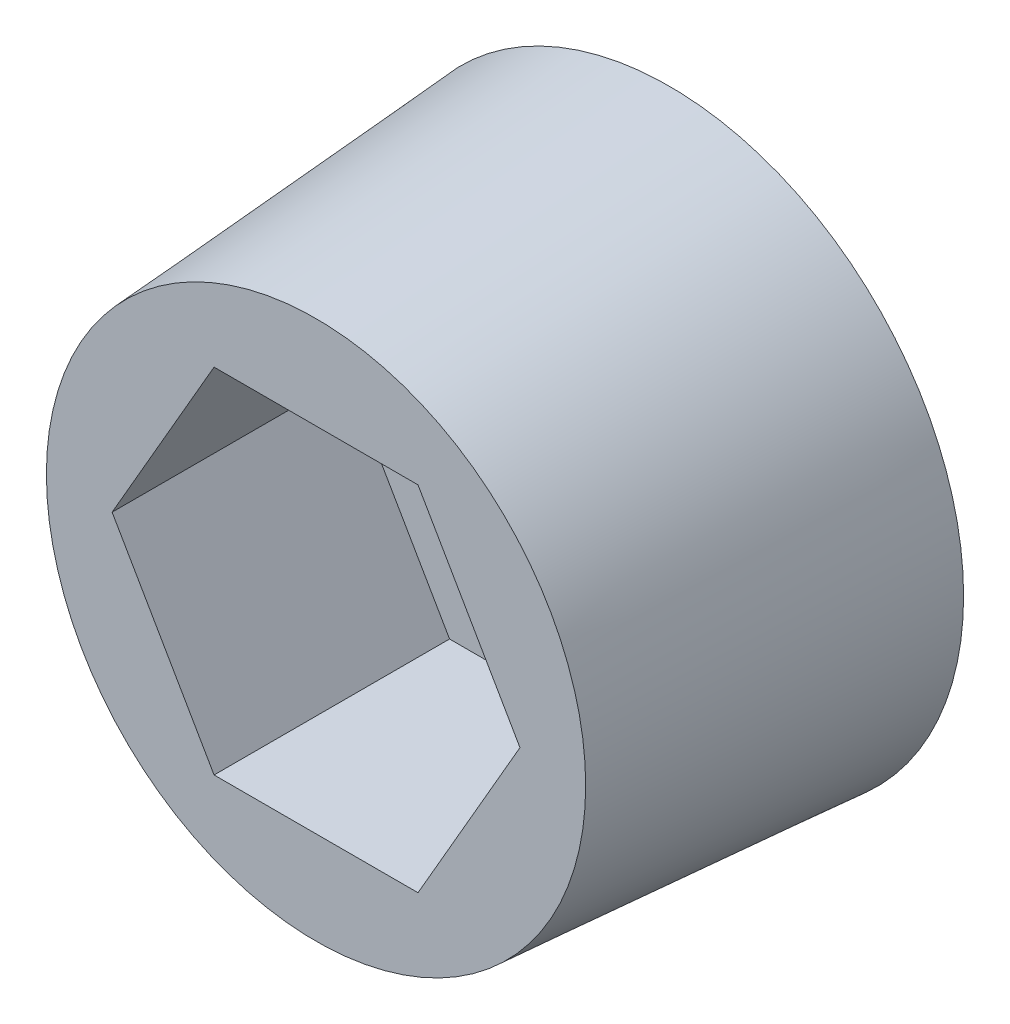
ISO-10303-21;
HEADER;
FILE_DESCRIPTION(('STEP AP214'),'2;1');
FILE_NAME('part.step','',(''),(''),'','','');
FILE_SCHEMA(('AUTOMOTIVE_DESIGN { 1 0 10303 214 1 1 1 1 }'));
ENDSEC;
DATA;
#1=APPLICATION_CONTEXT('core data for automotive mechanical design processes');
#2=APPLICATION_PROTOCOL_DEFINITION('international standard','automotive_design',2000,#1);
#3=PRODUCT_CONTEXT('',#1,'mechanical');
#4=PRODUCT('Part','Part','',(#3));
#5=PRODUCT_RELATED_PRODUCT_CATEGORY('part','',(#4));
#6=PRODUCT_DEFINITION_FORMATION('','',#4);
#7=PRODUCT_DEFINITION_CONTEXT('part definition',#1,'design');
#8=PRODUCT_DEFINITION('design','',#6,#7);
#9=PRODUCT_DEFINITION_SHAPE('','',#8);
#10=(LENGTH_UNIT() NAMED_UNIT(*) SI_UNIT(.MILLI.,.METRE.));
#11=(NAMED_UNIT(*) PLANE_ANGLE_UNIT() SI_UNIT($,.RADIAN.));
#12=(NAMED_UNIT(*) SI_UNIT($,.STERADIAN.) SOLID_ANGLE_UNIT());
#13=UNCERTAINTY_MEASURE_WITH_UNIT(LENGTH_MEASURE(1.E-05),#10,'distance_accuracy_value','');
#14=(GEOMETRIC_REPRESENTATION_CONTEXT(3) GLOBAL_UNCERTAINTY_ASSIGNED_CONTEXT((#13)) GLOBAL_UNIT_ASSIGNED_CONTEXT((#10,
#11,#12)) REPRESENTATION_CONTEXT('',''));
#15=CARTESIAN_POINT('',(0.,0.,0.));
#16=DIRECTION('',(0.,0.,1.));
#17=DIRECTION('',(1.,0.,0.));
#18=AXIS2_PLACEMENT_3D('',#15,#16,#17);
#19=CARTESIAN_POINT('',(0.,0.,0.));
#20=DIRECTION('',(0.,0.,-1.));
#21=DIRECTION('',(1.,0.,0.));
#22=AXIS2_PLACEMENT_3D('',#19,#20,#21);
#23=CONICAL_SURFACE('',#22,5.,0.0698131700797732);
#24=CARTESIAN_POINT('',(0.,0.,6.));
#25=DIRECTION('',(0.,0.,1.));
#26=DIRECTION('',(1.,0.,0.));
#27=AXIS2_PLACEMENT_3D('',#24,#25,#26);
#28=CIRCLE('',#27,4.58043912833894);
#29=CARTESIAN_POINT('',(4.58043912833894,0.,6.));
#30=VERTEX_POINT('',#29);
#31=EDGE_CURVE('E11',#30,#30,#28,.T.);
#32=ORIENTED_EDGE('',*,*,#31,.F.);
#33=EDGE_LOOP('',(#32));
#34=FACE_BOUND('',#33,.T.);
#35=CARTESIAN_POINT('',(0.,0.,0.));
#36=DIRECTION('',(0.,0.,1.));
#37=DIRECTION('',(1.,0.,0.));
#38=AXIS2_PLACEMENT_3D('',#35,#36,#37);
#39=CIRCLE('',#38,5.);
#40=CARTESIAN_POINT('',(5.,0.,0.));
#41=VERTEX_POINT('',#40);
#42=EDGE_CURVE('E47',#41,#41,#39,.T.);
#43=ORIENTED_EDGE('',*,*,#42,.T.);
#44=EDGE_LOOP('',(#43));
#45=FACE_BOUND('',#44,.T.);
#46=ADVANCED_FACE('F39',(#34,#45),#23,.T.);
#47=CARTESIAN_POINT('',(0.,0.,6.));
#48=DIRECTION('',(0.,0.,1.));
#49=DIRECTION('',(1.,0.,0.));
#50=AXIS2_PLACEMENT_3D('',#47,#48,#49);
#51=PLANE('',#50);
#52=DIRECTION('',(-0.5,0.866025403784438,0.));
#53=VECTOR('',#52,1.);
#54=CARTESIAN_POINT('',(3.46410161513776,0.,6.));
#55=LINE('',#54,#53);
#56=CARTESIAN_POINT('',(3.46410161513776,0.,6.));
#57=VERTEX_POINT('',#56);
#58=CARTESIAN_POINT('',(1.73205080756888,3.,6.));
#59=VERTEX_POINT('',#58);
#60=EDGE_CURVE('E54',#57,#59,#55,.T.);
#61=ORIENTED_EDGE('',*,*,#60,.F.);
#62=DIRECTION('',(0.5,0.866025403784439,0.));
#63=VECTOR('',#62,1.);
#64=CARTESIAN_POINT('',(1.73205080756888,-3.,6.));
#65=LINE('',#64,#63);
#66=CARTESIAN_POINT('',(1.73205080756888,-3.,6.));
#67=VERTEX_POINT('',#66);
#68=EDGE_CURVE('E148',#67,#57,#65,.T.);
#69=ORIENTED_EDGE('',*,*,#68,.F.);
#70=DIRECTION('',(1.,0.,0.));
#71=VECTOR('',#70,1.);
#72=CARTESIAN_POINT('',(-1.73205080756887,-3.,6.));
#73=LINE('',#72,#71);
#74=CARTESIAN_POINT('',(-1.73205080756887,-3.,6.));
#75=VERTEX_POINT('',#74);
#76=EDGE_CURVE('E145',#75,#67,#73,.T.);
#77=ORIENTED_EDGE('',*,*,#76,.F.);
#78=DIRECTION('',(0.5,-0.866025403784438,0.));
#79=VECTOR('',#78,1.);
#80=CARTESIAN_POINT('',(-3.46410161513775,0.,6.));
#81=LINE('',#80,#79);
#82=CARTESIAN_POINT('',(-3.46410161513775,0.,6.));
#83=VERTEX_POINT('',#82);
#84=EDGE_CURVE('E102',#83,#75,#81,.T.);
#85=ORIENTED_EDGE('',*,*,#84,.F.);
#86=DIRECTION('',(-0.5,-0.866025403784439,0.));
#87=VECTOR('',#86,1.);
#88=CARTESIAN_POINT('',(-1.73205080756888,3.,6.));
#89=LINE('',#88,#87);
#90=CARTESIAN_POINT('',(-1.73205080756888,3.,6.));
#91=VERTEX_POINT('',#90);
#92=EDGE_CURVE('E139',#91,#83,#89,.T.);
#93=ORIENTED_EDGE('',*,*,#92,.F.);
#94=DIRECTION('',(-1.,0.,0.));
#95=VECTOR('',#94,1.);
#96=CARTESIAN_POINT('',(1.73205080756888,3.,6.));
#97=LINE('',#96,#95);
#98=EDGE_CURVE('E134',#59,#91,#97,.T.);
#99=ORIENTED_EDGE('',*,*,#98,.F.);
#100=EDGE_LOOP('',(#61,#69,#77,#85,#93,#99));
#101=FACE_BOUND('',#100,.T.);
#102=ORIENTED_EDGE('',*,*,#31,.T.);
#103=EDGE_LOOP('',(#102));
#104=FACE_BOUND('',#103,.T.);
#105=ADVANCED_FACE('F170',(#101,#104),#51,.T.);
#106=CARTESIAN_POINT('',(0.,0.,0.));
#107=DIRECTION('',(0.,0.,1.));
#108=DIRECTION('',(1.,0.,0.));
#109=AXIS2_PLACEMENT_3D('',#106,#107,#108);
#110=PLANE('',#109);
#111=CARTESIAN_POINT('',(0.,0.,0.));
#112=DIRECTION('',(0.,0.,1.));
#113=DIRECTION('',(1.,0.,0.));
#114=AXIS2_PLACEMENT_3D('',#111,#112,#113);
#115=CIRCLE('',#114,1.65);
#116=CARTESIAN_POINT('',(1.65,0.,0.));
#117=VERTEX_POINT('',#116);
#118=EDGE_CURVE('E135',#117,#117,#115,.T.);
#119=ORIENTED_EDGE('',*,*,#118,.T.);
#120=EDGE_LOOP('',(#119));
#121=FACE_BOUND('',#120,.T.);
#122=ORIENTED_EDGE('',*,*,#42,.F.);
#123=EDGE_LOOP('',(#122));
#124=FACE_BOUND('',#123,.T.);
#125=ADVANCED_FACE('F167',(#121,#124),#110,.F.);
#126=CARTESIAN_POINT('',(3.46410161513776,0.,2.));
#127=DIRECTION('',(0.866025403784439,0.5,0.));
#128=DIRECTION('',(-0.5,0.866025403784438,0.));
#129=AXIS2_PLACEMENT_3D('',#126,#127,#128);
#130=PLANE('',#129);
#131=ORIENTED_EDGE('',*,*,#60,.T.);
#132=DIRECTION('',(0.,0.,1.));
#133=VECTOR('',#132,1.);
#134=CARTESIAN_POINT('',(1.73205080756888,3.,2.));
#135=LINE('',#134,#133);
#136=CARTESIAN_POINT('',(1.73205080756888,3.,2.));
#137=VERTEX_POINT('',#136);
#138=EDGE_CURVE('E84',#137,#59,#135,.T.);
#139=ORIENTED_EDGE('',*,*,#138,.F.);
#140=DIRECTION('',(-0.5,0.866025403784438,0.));
#141=VECTOR('',#140,1.);
#142=CARTESIAN_POINT('',(3.46410161513776,0.,2.));
#143=LINE('',#142,#141);
#144=CARTESIAN_POINT('',(3.46410161513776,0.,2.));
#145=VERTEX_POINT('',#144);
#146=EDGE_CURVE('E151',#145,#137,#143,.T.);
#147=ORIENTED_EDGE('',*,*,#146,.F.);
#148=DIRECTION('',(0.,0.,1.));
#149=VECTOR('',#148,1.);
#150=CARTESIAN_POINT('',(3.46410161513776,0.,2.));
#151=LINE('',#150,#149);
#152=EDGE_CURVE('E62',#145,#57,#151,.T.);
#153=ORIENTED_EDGE('',*,*,#152,.T.);
#154=EDGE_LOOP('',(#131,#139,#147,#153));
#155=FACE_BOUND('',#154,.T.);
#156=ADVANCED_FACE('F169',(#155),#130,.F.);
#157=CARTESIAN_POINT('',(1.73205080756888,-3.,2.));
#158=DIRECTION('',(0.866025403784439,-0.5,0.));
#159=DIRECTION('',(0.5,0.866025403784439,0.));
#160=AXIS2_PLACEMENT_3D('',#157,#158,#159);
#161=PLANE('',#160);
#162=ORIENTED_EDGE('',*,*,#68,.T.);
#163=ORIENTED_EDGE('',*,*,#152,.F.);
#164=DIRECTION('',(0.5,0.866025403784439,0.));
#165=VECTOR('',#164,1.);
#166=CARTESIAN_POINT('',(1.73205080756888,-3.,2.));
#167=LINE('',#166,#165);
#168=CARTESIAN_POINT('',(1.73205080756888,-3.,2.));
#169=VERTEX_POINT('',#168);
#170=EDGE_CURVE('E116',#169,#145,#167,.T.);
#171=ORIENTED_EDGE('',*,*,#170,.F.);
#172=DIRECTION('',(0.,0.,1.));
#173=VECTOR('',#172,1.);
#174=CARTESIAN_POINT('',(1.73205080756888,-3.,2.));
#175=LINE('',#174,#173);
#176=EDGE_CURVE('E107',#169,#67,#175,.T.);
#177=ORIENTED_EDGE('',*,*,#176,.T.);
#178=EDGE_LOOP('',(#162,#163,#171,#177));
#179=FACE_BOUND('',#178,.T.);
#180=ADVANCED_FACE('F176',(#179),#161,.F.);
#181=CARTESIAN_POINT('',(-1.73205080756887,-3.,2.));
#182=DIRECTION('',(0.,-1.,0.));
#183=DIRECTION('',(1.,0.,0.));
#184=AXIS2_PLACEMENT_3D('',#181,#182,#183);
#185=PLANE('',#184);
#186=ORIENTED_EDGE('',*,*,#76,.T.);
#187=ORIENTED_EDGE('',*,*,#176,.F.);
#188=DIRECTION('',(1.,0.,0.));
#189=VECTOR('',#188,1.);
#190=CARTESIAN_POINT('',(-1.73205080756887,-3.,2.));
#191=LINE('',#190,#189);
#192=CARTESIAN_POINT('',(-1.73205080756887,-3.,2.));
#193=VERTEX_POINT('',#192);
#194=EDGE_CURVE('E111',#193,#169,#191,.T.);
#195=ORIENTED_EDGE('',*,*,#194,.F.);
#196=DIRECTION('',(0.,0.,1.));
#197=VECTOR('',#196,1.);
#198=CARTESIAN_POINT('',(-1.73205080756887,-3.,2.));
#199=LINE('',#198,#197);
#200=EDGE_CURVE('E95',#193,#75,#199,.T.);
#201=ORIENTED_EDGE('',*,*,#200,.T.);
#202=EDGE_LOOP('',(#186,#187,#195,#201));
#203=FACE_BOUND('',#202,.T.);
#204=ADVANCED_FACE('F112',(#203),#185,.F.);
#205=CARTESIAN_POINT('',(-3.46410161513775,0.,2.));
#206=DIRECTION('',(-0.866025403784439,-0.5,0.));
#207=DIRECTION('',(0.5,-0.866025403784438,0.));
#208=AXIS2_PLACEMENT_3D('',#205,#206,#207);
#209=PLANE('',#208);
#210=ORIENTED_EDGE('',*,*,#84,.T.);
#211=ORIENTED_EDGE('',*,*,#200,.F.);
#212=DIRECTION('',(0.5,-0.866025403784438,0.));
#213=VECTOR('',#212,1.);
#214=CARTESIAN_POINT('',(-3.46410161513775,0.,2.));
#215=LINE('',#214,#213);
#216=CARTESIAN_POINT('',(-3.46410161513775,0.,2.));
#217=VERTEX_POINT('',#216);
#218=EDGE_CURVE('E99',#217,#193,#215,.T.);
#219=ORIENTED_EDGE('',*,*,#218,.F.);
#220=DIRECTION('',(0.,0.,1.));
#221=VECTOR('',#220,1.);
#222=CARTESIAN_POINT('',(-3.46410161513775,0.,2.));
#223=LINE('',#222,#221);
#224=EDGE_CURVE('E108',#217,#83,#223,.T.);
#225=ORIENTED_EDGE('',*,*,#224,.T.);
#226=EDGE_LOOP('',(#210,#211,#219,#225));
#227=FACE_BOUND('',#226,.T.);
#228=ADVANCED_FACE('F97',(#227),#209,.F.);
#229=CARTESIAN_POINT('',(-1.73205080756888,3.,2.));
#230=DIRECTION('',(-0.866025403784439,0.5,0.));
#231=DIRECTION('',(-0.5,-0.866025403784439,0.));
#232=AXIS2_PLACEMENT_3D('',#229,#230,#231);
#233=PLANE('',#232);
#234=ORIENTED_EDGE('',*,*,#92,.T.);
#235=ORIENTED_EDGE('',*,*,#224,.F.);
#236=DIRECTION('',(-0.5,-0.866025403784439,0.));
#237=VECTOR('',#236,1.);
#238=CARTESIAN_POINT('',(-1.73205080756888,3.,2.));
#239=LINE('',#238,#237);
#240=CARTESIAN_POINT('',(-1.73205080756888,3.,2.));
#241=VERTEX_POINT('',#240);
#242=EDGE_CURVE('E122',#241,#217,#239,.T.);
#243=ORIENTED_EDGE('',*,*,#242,.F.);
#244=DIRECTION('',(0.,0.,1.));
#245=VECTOR('',#244,1.);
#246=CARTESIAN_POINT('',(-1.73205080756888,3.,2.));
#247=LINE('',#246,#245);
#248=EDGE_CURVE('E158',#241,#91,#247,.T.);
#249=ORIENTED_EDGE('',*,*,#248,.T.);
#250=EDGE_LOOP('',(#234,#235,#243,#249));
#251=FACE_BOUND('',#250,.T.);
#252=ADVANCED_FACE('F223',(#251),#233,.F.);
#253=CARTESIAN_POINT('',(1.73205080756888,3.,2.));
#254=DIRECTION('',(0.,1.,0.));
#255=DIRECTION('',(0.,0.,1.));
#256=AXIS2_PLACEMENT_3D('',#253,#254,#255);
#257=PLANE('',#256);
#258=ORIENTED_EDGE('',*,*,#98,.T.);
#259=ORIENTED_EDGE('',*,*,#248,.F.);
#260=DIRECTION('',(-1.,0.,0.));
#261=VECTOR('',#260,1.);
#262=CARTESIAN_POINT('',(1.73205080756888,3.,2.));
#263=LINE('',#262,#261);
#264=EDGE_CURVE('E126',#137,#241,#263,.T.);
#265=ORIENTED_EDGE('',*,*,#264,.F.);
#266=ORIENTED_EDGE('',*,*,#138,.T.);
#267=EDGE_LOOP('',(#258,#259,#265,#266));
#268=FACE_BOUND('',#267,.T.);
#269=ADVANCED_FACE('F232',(#268),#257,.F.);
#270=CARTESIAN_POINT('',(0.,0.,2.));
#271=DIRECTION('',(0.,0.,1.));
#272=DIRECTION('',(1.,0.,0.));
#273=AXIS2_PLACEMENT_3D('',#270,#271,#272);
#274=PLANE('',#273);
#275=CARTESIAN_POINT('',(0.,0.,2.));
#276=DIRECTION('',(0.,0.,1.));
#277=DIRECTION('',(1.,0.,0.));
#278=AXIS2_PLACEMENT_3D('',#275,#276,#277);
#279=CIRCLE('',#278,1.65);
#280=CARTESIAN_POINT('',(1.65,0.,2.));
#281=VERTEX_POINT('',#280);
#282=EDGE_CURVE('E272',#281,#281,#279,.T.);
#283=ORIENTED_EDGE('',*,*,#282,.F.);
#284=EDGE_LOOP('',(#283));
#285=FACE_BOUND('',#284,.T.);
#286=ORIENTED_EDGE('',*,*,#146,.T.);
#287=ORIENTED_EDGE('',*,*,#264,.T.);
#288=ORIENTED_EDGE('',*,*,#242,.T.);
#289=ORIENTED_EDGE('',*,*,#218,.T.);
#290=ORIENTED_EDGE('',*,*,#194,.T.);
#291=ORIENTED_EDGE('',*,*,#170,.T.);
#292=EDGE_LOOP('',(#286,#287,#288,#289,#290,#291));
#293=FACE_BOUND('',#292,.T.);
#294=ADVANCED_FACE('F119',(#285,#293),#274,.T.);
#295=CARTESIAN_POINT('',(0.,0.,0.));
#296=DIRECTION('',(0.,0.,1.));
#297=DIRECTION('',(1.,0.,0.));
#298=AXIS2_PLACEMENT_3D('',#295,#296,#297);
#299=CYLINDRICAL_SURFACE('',#298,1.65);
#300=ORIENTED_EDGE('',*,*,#118,.F.);
#301=EDGE_LOOP('',(#300));
#302=FACE_BOUND('',#301,.T.);
#303=ORIENTED_EDGE('',*,*,#282,.T.);
#304=EDGE_LOOP('',(#303));
#305=FACE_BOUND('',#304,.T.);
#306=ADVANCED_FACE('F254',(#302,#305),#299,.F.);
#307=CLOSED_SHELL('',(#46,#105,#125,#156,#180,#204,#228,#252,#269,#294,#306));
#308=MANIFOLD_SOLID_BREP('B2',#307);
#309=ADVANCED_BREP_SHAPE_REPRESENTATION('',(#18,#308),#14);
#310=SHAPE_DEFINITION_REPRESENTATION(#9,#309);
ENDSEC;
END-ISO-10303-21;
